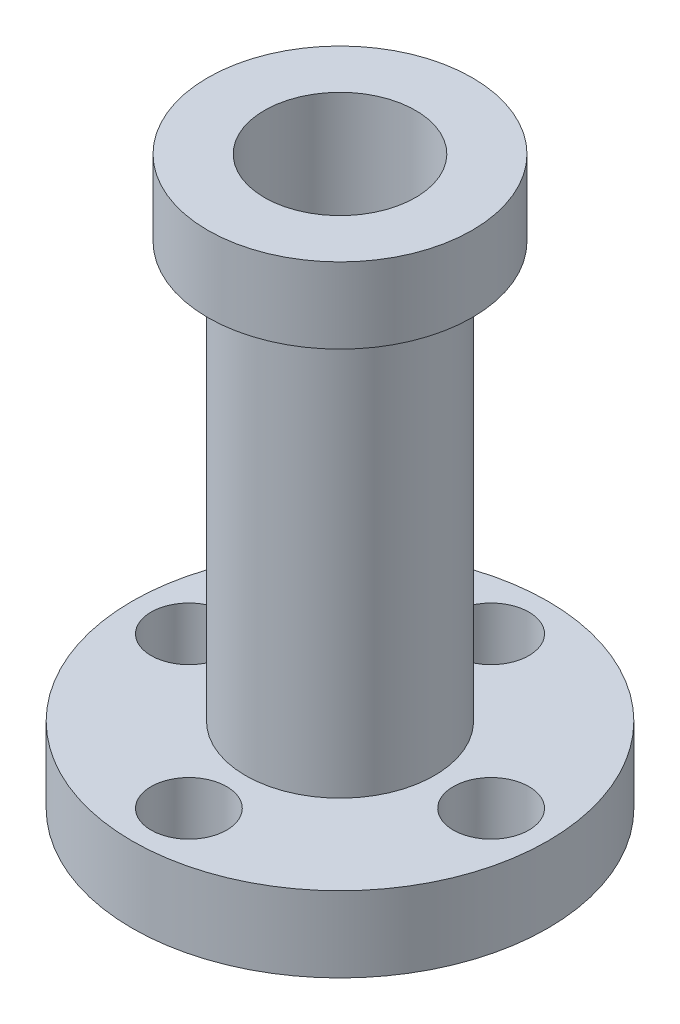
ISO-10303-21;
HEADER;
FILE_DESCRIPTION(('STEP AP214'),'2;1');
FILE_NAME('part.step','',(''),(''),'','','');
FILE_SCHEMA(('AUTOMOTIVE_DESIGN { 1 0 10303 214 1 1 1 1 }'));
ENDSEC;
DATA;
#1=APPLICATION_CONTEXT('core data for automotive mechanical design processes');
#2=APPLICATION_PROTOCOL_DEFINITION('international standard','automotive_design',2000,#1);
#3=PRODUCT_CONTEXT('',#1,'mechanical');
#4=PRODUCT('Part','Part','',(#3));
#5=PRODUCT_RELATED_PRODUCT_CATEGORY('part','',(#4));
#6=PRODUCT_DEFINITION_FORMATION('','',#4);
#7=PRODUCT_DEFINITION_CONTEXT('part definition',#1,'design');
#8=PRODUCT_DEFINITION('design','',#6,#7);
#9=PRODUCT_DEFINITION_SHAPE('','',#8);
#10=(LENGTH_UNIT() NAMED_UNIT(*) SI_UNIT(.MILLI.,.METRE.));
#11=(NAMED_UNIT(*) PLANE_ANGLE_UNIT() SI_UNIT($,.RADIAN.));
#12=(NAMED_UNIT(*) SI_UNIT($,.STERADIAN.) SOLID_ANGLE_UNIT());
#13=UNCERTAINTY_MEASURE_WITH_UNIT(LENGTH_MEASURE(1.E-05),#10,'distance_accuracy_value','');
#14=(GEOMETRIC_REPRESENTATION_CONTEXT(3) GLOBAL_UNCERTAINTY_ASSIGNED_CONTEXT((#13)) GLOBAL_UNIT_ASSIGNED_CONTEXT((#10,
#11,#12)) REPRESENTATION_CONTEXT('',''));
#15=CARTESIAN_POINT('',(0.,0.,0.));
#16=DIRECTION('',(0.,0.,1.));
#17=DIRECTION('',(1.,0.,0.));
#18=AXIS2_PLACEMENT_3D('',#15,#16,#17);
#19=CARTESIAN_POINT('',(11.,0.,0.));
#20=DIRECTION('',(0.,-1.,0.));
#21=DIRECTION('',(0.,0.,-1.));
#22=AXIS2_PLACEMENT_3D('',#19,#20,#21);
#23=PLANE('',#22);
#24=CARTESIAN_POINT('',(0.,0.,-8.));
#25=DIRECTION('',(0.,-1.,0.));
#26=DIRECTION('',(0.,0.,-1.));
#27=AXIS2_PLACEMENT_3D('',#24,#25,#26);
#28=CIRCLE('',#27,2.);
#29=CARTESIAN_POINT('',(0.,0.,-10.));
#30=VERTEX_POINT('',#29);
#31=EDGE_CURVE('E72',#30,#30,#28,.T.);
#32=ORIENTED_EDGE('',*,*,#31,.F.);
#33=EDGE_LOOP('',(#32));
#34=FACE_BOUND('',#33,.T.);
#35=CARTESIAN_POINT('',(-8.,0.,0.));
#36=DIRECTION('',(0.,-1.,0.));
#37=DIRECTION('',(0.,0.,-1.));
#38=AXIS2_PLACEMENT_3D('',#35,#36,#37);
#39=CIRCLE('',#38,2.);
#40=CARTESIAN_POINT('',(-8.,0.,-2.));
#41=VERTEX_POINT('',#40);
#42=EDGE_CURVE('E75',#41,#41,#39,.T.);
#43=ORIENTED_EDGE('',*,*,#42,.F.);
#44=EDGE_LOOP('',(#43));
#45=FACE_BOUND('',#44,.T.);
#46=CARTESIAN_POINT('',(0.,0.,8.));
#47=DIRECTION('',(0.,-1.,0.));
#48=DIRECTION('',(0.,0.,-1.));
#49=AXIS2_PLACEMENT_3D('',#46,#47,#48);
#50=CIRCLE('',#49,2.);
#51=CARTESIAN_POINT('',(0.,0.,6.));
#52=VERTEX_POINT('',#51);
#53=EDGE_CURVE('E78',#52,#52,#50,.T.);
#54=ORIENTED_EDGE('',*,*,#53,.F.);
#55=EDGE_LOOP('',(#54));
#56=FACE_BOUND('',#55,.T.);
#57=CARTESIAN_POINT('',(8.,0.,0.));
#58=DIRECTION('',(0.,-1.,0.));
#59=DIRECTION('',(0.,0.,-1.));
#60=AXIS2_PLACEMENT_3D('',#57,#58,#59);
#61=CIRCLE('',#60,2.);
#62=CARTESIAN_POINT('',(8.,0.,-2.));
#63=VERTEX_POINT('',#62);
#64=EDGE_CURVE('E66',#63,#63,#61,.T.);
#65=ORIENTED_EDGE('',*,*,#64,.F.);
#66=EDGE_LOOP('',(#65));
#67=FACE_BOUND('',#66,.T.);
#68=CARTESIAN_POINT('',(0.,0.,0.));
#69=DIRECTION('',(0.,-1.,0.));
#70=DIRECTION('',(0.,0.,-1.));
#71=AXIS2_PLACEMENT_3D('',#68,#69,#70);
#72=CIRCLE('',#71,4.);
#73=CARTESIAN_POINT('',(0.,0.,-4.));
#74=VERTEX_POINT('',#73);
#75=EDGE_CURVE('E60',#74,#74,#72,.T.);
#76=ORIENTED_EDGE('',*,*,#75,.F.);
#77=EDGE_LOOP('',(#76));
#78=FACE_BOUND('',#77,.T.);
#79=CARTESIAN_POINT('',(0.,0.,0.));
#80=DIRECTION('',(0.,-1.,0.));
#81=DIRECTION('',(0.,0.,-1.));
#82=AXIS2_PLACEMENT_3D('',#79,#80,#81);
#83=CIRCLE('',#82,11.);
#84=CARTESIAN_POINT('',(0.,0.,-11.));
#85=VERTEX_POINT('',#84);
#86=EDGE_CURVE('E57',#85,#85,#83,.T.);
#87=ORIENTED_EDGE('',*,*,#86,.T.);
#88=EDGE_LOOP('',(#87));
#89=FACE_BOUND('',#88,.T.);
#90=ADVANCED_FACE('F35',(#34,#45,#56,#67,#78,#89),#23,.T.);
#91=CARTESIAN_POINT('',(0.,30.,0.));
#92=DIRECTION('',(0.,1.,0.));
#93=DIRECTION('',(0.,0.,1.));
#94=AXIS2_PLACEMENT_3D('',#91,#92,#93);
#95=PLANE('',#94);
#96=CARTESIAN_POINT('',(0.,30.,0.));
#97=DIRECTION('',(0.,1.,0.));
#98=DIRECTION('',(0.,0.,1.));
#99=AXIS2_PLACEMENT_3D('',#96,#97,#98);
#100=CIRCLE('',#99,4.);
#101=CARTESIAN_POINT('',(0.,30.,4.));
#102=VERTEX_POINT('',#101);
#103=EDGE_CURVE('E63',#102,#102,#100,.T.);
#104=ORIENTED_EDGE('',*,*,#103,.F.);
#105=EDGE_LOOP('',(#104));
#106=FACE_BOUND('',#105,.T.);
#107=CARTESIAN_POINT('',(0.,30.,0.));
#108=DIRECTION('',(0.,-1.,0.));
#109=DIRECTION('',(0.,0.,-1.));
#110=AXIS2_PLACEMENT_3D('',#107,#108,#109);
#111=CIRCLE('',#110,7.);
#112=CARTESIAN_POINT('',(0.,30.,-7.));
#113=VERTEX_POINT('',#112);
#114=EDGE_CURVE('E10',#113,#113,#111,.T.);
#115=ORIENTED_EDGE('',*,*,#114,.F.);
#116=EDGE_LOOP('',(#115));
#117=FACE_BOUND('',#116,.T.);
#118=ADVANCED_FACE('F116',(#106,#117),#95,.T.);
#119=CARTESIAN_POINT('',(0.,0.,0.));
#120=DIRECTION('',(0.,-1.,0.));
#121=DIRECTION('',(0.,0.,-1.));
#122=AXIS2_PLACEMENT_3D('',#119,#120,#121);
#123=CYLINDRICAL_SURFACE('',#122,7.);
#124=ORIENTED_EDGE('',*,*,#114,.T.);
#125=EDGE_LOOP('',(#124));
#126=FACE_BOUND('',#125,.T.);
#127=CARTESIAN_POINT('',(0.,26.,0.));
#128=DIRECTION('',(0.,-1.,0.));
#129=DIRECTION('',(0.,0.,-1.));
#130=AXIS2_PLACEMENT_3D('',#127,#128,#129);
#131=CIRCLE('',#130,7.);
#132=CARTESIAN_POINT('',(0.,26.,-7.));
#133=VERTEX_POINT('',#132);
#134=EDGE_CURVE('E41',#133,#133,#131,.T.);
#135=ORIENTED_EDGE('',*,*,#134,.F.);
#136=EDGE_LOOP('',(#135));
#137=FACE_BOUND('',#136,.T.);
#138=ADVANCED_FACE('F121',(#126,#137),#123,.T.);
#139=CARTESIAN_POINT('',(7.,26.,0.));
#140=DIRECTION('',(0.,-1.,0.));
#141=DIRECTION('',(0.,0.,-1.));
#142=AXIS2_PLACEMENT_3D('',#139,#140,#141);
#143=PLANE('',#142);
#144=ORIENTED_EDGE('',*,*,#134,.T.);
#145=EDGE_LOOP('',(#144));
#146=FACE_BOUND('',#145,.T.);
#147=CARTESIAN_POINT('',(0.,26.,0.));
#148=DIRECTION('',(0.,-1.,0.));
#149=DIRECTION('',(0.,0.,-1.));
#150=AXIS2_PLACEMENT_3D('',#147,#148,#149);
#151=CIRCLE('',#150,5.);
#152=CARTESIAN_POINT('',(0.,26.,-5.));
#153=VERTEX_POINT('',#152);
#154=EDGE_CURVE('E45',#153,#153,#151,.T.);
#155=ORIENTED_EDGE('',*,*,#154,.F.);
#156=EDGE_LOOP('',(#155));
#157=FACE_BOUND('',#156,.T.);
#158=ADVANCED_FACE('F149',(#146,#157),#143,.T.);
#159=CARTESIAN_POINT('',(0.,0.,0.));
#160=DIRECTION('',(0.,-1.,0.));
#161=DIRECTION('',(0.,0.,-1.));
#162=AXIS2_PLACEMENT_3D('',#159,#160,#161);
#163=CYLINDRICAL_SURFACE('',#162,5.);
#164=ORIENTED_EDGE('',*,*,#154,.T.);
#165=EDGE_LOOP('',(#164));
#166=FACE_BOUND('',#165,.T.);
#167=CARTESIAN_POINT('',(0.,4.,0.));
#168=DIRECTION('',(0.,-1.,0.));
#169=DIRECTION('',(0.,0.,-1.));
#170=AXIS2_PLACEMENT_3D('',#167,#168,#169);
#171=CIRCLE('',#170,5.);
#172=CARTESIAN_POINT('',(0.,4.,-5.));
#173=VERTEX_POINT('',#172);
#174=EDGE_CURVE('E49',#173,#173,#171,.T.);
#175=ORIENTED_EDGE('',*,*,#174,.F.);
#176=EDGE_LOOP('',(#175));
#177=FACE_BOUND('',#176,.T.);
#178=ADVANCED_FACE('F97',(#166,#177),#163,.T.);
#179=CARTESIAN_POINT('',(5.,4.,0.));
#180=DIRECTION('',(0.,1.,0.));
#181=DIRECTION('',(0.,0.,1.));
#182=AXIS2_PLACEMENT_3D('',#179,#180,#181);
#183=PLANE('',#182);
#184=CARTESIAN_POINT('',(0.,4.,-8.));
#185=DIRECTION('',(0.,1.,0.));
#186=DIRECTION('',(0.,0.,1.));
#187=AXIS2_PLACEMENT_3D('',#184,#185,#186);
#188=CIRCLE('',#187,2.);
#189=CARTESIAN_POINT('',(0.,4.,-6.));
#190=VERTEX_POINT('',#189);
#191=EDGE_CURVE('E81',#190,#190,#188,.T.);
#192=ORIENTED_EDGE('',*,*,#191,.F.);
#193=EDGE_LOOP('',(#192));
#194=FACE_BOUND('',#193,.T.);
#195=CARTESIAN_POINT('',(-8.,4.,0.));
#196=DIRECTION('',(0.,1.,0.));
#197=DIRECTION('',(0.,0.,1.));
#198=AXIS2_PLACEMENT_3D('',#195,#196,#197);
#199=CIRCLE('',#198,2.);
#200=CARTESIAN_POINT('',(-8.,4.,2.));
#201=VERTEX_POINT('',#200);
#202=EDGE_CURVE('E85',#201,#201,#199,.T.);
#203=ORIENTED_EDGE('',*,*,#202,.F.);
#204=EDGE_LOOP('',(#203));
#205=FACE_BOUND('',#204,.T.);
#206=CARTESIAN_POINT('',(0.,4.,8.));
#207=DIRECTION('',(0.,1.,0.));
#208=DIRECTION('',(0.,0.,1.));
#209=AXIS2_PLACEMENT_3D('',#206,#207,#208);
#210=CIRCLE('',#209,2.);
#211=CARTESIAN_POINT('',(0.,4.,10.));
#212=VERTEX_POINT('',#211);
#213=EDGE_CURVE('E82',#212,#212,#210,.T.);
#214=ORIENTED_EDGE('',*,*,#213,.F.);
#215=EDGE_LOOP('',(#214));
#216=FACE_BOUND('',#215,.T.);
#217=CARTESIAN_POINT('',(8.,4.,0.));
#218=DIRECTION('',(0.,1.,0.));
#219=DIRECTION('',(0.,0.,1.));
#220=AXIS2_PLACEMENT_3D('',#217,#218,#219);
#221=CIRCLE('',#220,2.);
#222=CARTESIAN_POINT('',(8.,4.,2.));
#223=VERTEX_POINT('',#222);
#224=EDGE_CURVE('E69',#223,#223,#221,.T.);
#225=ORIENTED_EDGE('',*,*,#224,.F.);
#226=EDGE_LOOP('',(#225));
#227=FACE_BOUND('',#226,.T.);
#228=ORIENTED_EDGE('',*,*,#174,.T.);
#229=EDGE_LOOP('',(#228));
#230=FACE_BOUND('',#229,.T.);
#231=CARTESIAN_POINT('',(0.,4.,0.));
#232=DIRECTION('',(0.,-1.,0.));
#233=DIRECTION('',(0.,0.,-1.));
#234=AXIS2_PLACEMENT_3D('',#231,#232,#233);
#235=CIRCLE('',#234,11.);
#236=CARTESIAN_POINT('',(0.,4.,-11.));
#237=VERTEX_POINT('',#236);
#238=EDGE_CURVE('E54',#237,#237,#235,.T.);
#239=ORIENTED_EDGE('',*,*,#238,.F.);
#240=EDGE_LOOP('',(#239));
#241=FACE_BOUND('',#240,.T.);
#242=ADVANCED_FACE('F93',(#194,#205,#216,#227,#230,#241),#183,.T.);
#243=CARTESIAN_POINT('',(0.,0.,0.));
#244=DIRECTION('',(0.,-1.,0.));
#245=DIRECTION('',(0.,0.,-1.));
#246=AXIS2_PLACEMENT_3D('',#243,#244,#245);
#247=CYLINDRICAL_SURFACE('',#246,11.);
#248=ORIENTED_EDGE('',*,*,#238,.T.);
#249=EDGE_LOOP('',(#248));
#250=FACE_BOUND('',#249,.T.);
#251=ORIENTED_EDGE('',*,*,#86,.F.);
#252=EDGE_LOOP('',(#251));
#253=FACE_BOUND('',#252,.T.);
#254=ADVANCED_FACE('F96',(#250,#253),#247,.T.);
#255=CARTESIAN_POINT('',(0.,-1.60000000000001,0.));
#256=DIRECTION('',(0.,1.,0.));
#257=DIRECTION('',(0.,0.,1.));
#258=AXIS2_PLACEMENT_3D('',#255,#256,#257);
#259=CYLINDRICAL_SURFACE('',#258,4.);
#260=ORIENTED_EDGE('',*,*,#75,.T.);
#261=EDGE_LOOP('',(#260));
#262=FACE_BOUND('',#261,.T.);
#263=ORIENTED_EDGE('',*,*,#103,.T.);
#264=EDGE_LOOP('',(#263));
#265=FACE_BOUND('',#264,.T.);
#266=ADVANCED_FACE('F111',(#262,#265),#259,.F.);
#267=CARTESIAN_POINT('',(8.,-27.6,0.));
#268=DIRECTION('',(0.,1.,0.));
#269=DIRECTION('',(0.,0.,1.));
#270=AXIS2_PLACEMENT_3D('',#267,#268,#269);
#271=CYLINDRICAL_SURFACE('',#270,2.);
#272=ORIENTED_EDGE('',*,*,#64,.T.);
#273=EDGE_LOOP('',(#272));
#274=FACE_BOUND('',#273,.T.);
#275=ORIENTED_EDGE('',*,*,#224,.T.);
#276=EDGE_LOOP('',(#275));
#277=FACE_BOUND('',#276,.T.);
#278=ADVANCED_FACE('F135',(#274,#277),#271,.F.);
#279=CARTESIAN_POINT('',(0.,-27.6,8.));
#280=DIRECTION('',(0.,1.,0.));
#281=DIRECTION('',(0.,0.,1.));
#282=AXIS2_PLACEMENT_3D('',#279,#280,#281);
#283=CYLINDRICAL_SURFACE('',#282,2.);
#284=ORIENTED_EDGE('',*,*,#53,.T.);
#285=EDGE_LOOP('',(#284));
#286=FACE_BOUND('',#285,.T.);
#287=ORIENTED_EDGE('',*,*,#213,.T.);
#288=EDGE_LOOP('',(#287));
#289=FACE_BOUND('',#288,.T.);
#290=ADVANCED_FACE('F142',(#286,#289),#283,.F.);
#291=CARTESIAN_POINT('',(-8.,-27.6,0.));
#292=DIRECTION('',(0.,1.,0.));
#293=DIRECTION('',(0.,0.,1.));
#294=AXIS2_PLACEMENT_3D('',#291,#292,#293);
#295=CYLINDRICAL_SURFACE('',#294,2.);
#296=ORIENTED_EDGE('',*,*,#42,.T.);
#297=EDGE_LOOP('',(#296));
#298=FACE_BOUND('',#297,.T.);
#299=ORIENTED_EDGE('',*,*,#202,.T.);
#300=EDGE_LOOP('',(#299));
#301=FACE_BOUND('',#300,.T.);
#302=ADVANCED_FACE('F202',(#298,#301),#295,.F.);
#303=CARTESIAN_POINT('',(0.,-27.6,-8.));
#304=DIRECTION('',(0.,1.,0.));
#305=DIRECTION('',(0.,0.,1.));
#306=AXIS2_PLACEMENT_3D('',#303,#304,#305);
#307=CYLINDRICAL_SURFACE('',#306,2.);
#308=ORIENTED_EDGE('',*,*,#31,.T.);
#309=EDGE_LOOP('',(#308));
#310=FACE_BOUND('',#309,.T.);
#311=ORIENTED_EDGE('',*,*,#191,.T.);
#312=EDGE_LOOP('',(#311));
#313=FACE_BOUND('',#312,.T.);
#314=ADVANCED_FACE('F91',(#310,#313),#307,.F.);
#315=CLOSED_SHELL('',(#90,#118,#138,#158,#178,#242,#254,#266,#278,#290,#302,#314));
#316=MANIFOLD_SOLID_BREP('B2',#315);
#317=ADVANCED_BREP_SHAPE_REPRESENTATION('',(#18,#316),#14);
#318=SHAPE_DEFINITION_REPRESENTATION(#9,#317);
ENDSEC;
END-ISO-10303-21;
